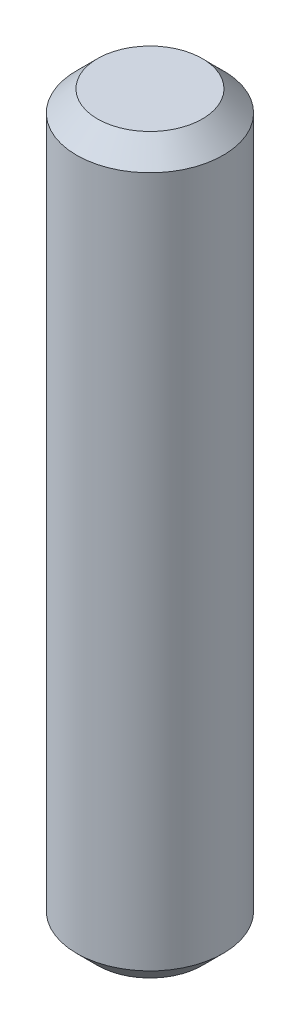
ISO-10303-21;
HEADER;
FILE_DESCRIPTION(('STEP AP214'),'2;1');
FILE_NAME('part.step','',(''),(''),'','','');
FILE_SCHEMA(('AUTOMOTIVE_DESIGN { 1 0 10303 214 1 1 1 1 }'));
ENDSEC;
DATA;
#1=APPLICATION_CONTEXT('core data for automotive mechanical design processes');
#2=APPLICATION_PROTOCOL_DEFINITION('international standard','automotive_design',2000,#1);
#3=PRODUCT_CONTEXT('',#1,'mechanical');
#4=PRODUCT('Part','Part','',(#3));
#5=PRODUCT_RELATED_PRODUCT_CATEGORY('part','',(#4));
#6=PRODUCT_DEFINITION_FORMATION('','',#4);
#7=PRODUCT_DEFINITION_CONTEXT('part definition',#1,'design');
#8=PRODUCT_DEFINITION('design','',#6,#7);
#9=PRODUCT_DEFINITION_SHAPE('','',#8);
#10=(LENGTH_UNIT() NAMED_UNIT(*) SI_UNIT(.MILLI.,.METRE.));
#11=(NAMED_UNIT(*) PLANE_ANGLE_UNIT() SI_UNIT($,.RADIAN.));
#12=(NAMED_UNIT(*) SI_UNIT($,.STERADIAN.) SOLID_ANGLE_UNIT());
#13=UNCERTAINTY_MEASURE_WITH_UNIT(LENGTH_MEASURE(1.E-05),#10,'distance_accuracy_value','');
#14=(GEOMETRIC_REPRESENTATION_CONTEXT(3) GLOBAL_UNCERTAINTY_ASSIGNED_CONTEXT((#13)) GLOBAL_UNIT_ASSIGNED_CONTEXT((#10,
#11,#12)) REPRESENTATION_CONTEXT('',''));
#15=CARTESIAN_POINT('',(0.,0.,0.));
#16=DIRECTION('',(0.,0.,1.));
#17=DIRECTION('',(1.,0.,0.));
#18=AXIS2_PLACEMENT_3D('',#15,#16,#17);
#19=CARTESIAN_POINT('',(0.,70.,0.));
#20=DIRECTION('',(0.,-1.,0.));
#21=DIRECTION('',(0.,0.,-1.));
#22=AXIS2_PLACEMENT_3D('',#19,#20,#21);
#23=CYLINDRICAL_SURFACE('',#22,7.);
#24=CARTESIAN_POINT('',(0.,2.00000000000002,0.));
#25=DIRECTION('',(0.,1.,0.));
#26=DIRECTION('',(0.,0.,1.));
#27=AXIS2_PLACEMENT_3D('',#24,#25,#26);
#28=CIRCLE('',#27,7.);
#29=CARTESIAN_POINT('',(0.,2.00000000000002,7.));
#30=VERTEX_POINT('',#29);
#31=EDGE_CURVE('E59',#30,#30,#28,.T.);
#32=ORIENTED_EDGE('',*,*,#31,.T.);
#33=EDGE_LOOP('',(#32));
#34=FACE_BOUND('',#33,.T.);
#35=CARTESIAN_POINT('',(0.,68.,0.));
#36=DIRECTION('',(0.,1.,0.));
#37=DIRECTION('',(0.,0.,1.));
#38=AXIS2_PLACEMENT_3D('',#35,#36,#37);
#39=CIRCLE('',#38,7.);
#40=CARTESIAN_POINT('',(0.,68.,7.));
#41=VERTEX_POINT('',#40);
#42=EDGE_CURVE('E64',#41,#41,#39,.F.);
#43=ORIENTED_EDGE('',*,*,#42,.T.);
#44=EDGE_LOOP('',(#43));
#45=FACE_BOUND('',#44,.T.);
#46=ADVANCED_FACE('F45',(#34,#45),#23,.T.);
#47=CARTESIAN_POINT('',(0.,70.,0.));
#48=DIRECTION('',(0.,1.,0.));
#49=DIRECTION('',(0.,0.,1.));
#50=AXIS2_PLACEMENT_3D('',#47,#48,#49);
#51=PLANE('',#50);
#52=CARTESIAN_POINT('',(0.,70.,0.));
#53=DIRECTION('',(0.,1.,0.));
#54=DIRECTION('',(0.,0.,1.));
#55=AXIS2_PLACEMENT_3D('',#52,#53,#54);
#56=CIRCLE('',#55,4.99999999999998);
#57=CARTESIAN_POINT('',(0.,70.,4.99999999999998));
#58=VERTEX_POINT('',#57);
#59=EDGE_CURVE('E10',#58,#58,#56,.T.);
#60=ORIENTED_EDGE('',*,*,#59,.T.);
#61=EDGE_LOOP('',(#60));
#62=FACE_BOUND('',#61,.T.);
#63=ADVANCED_FACE('F81',(#62),#51,.T.);
#64=CARTESIAN_POINT('',(0.,0.,0.));
#65=DIRECTION('',(0.,1.,0.));
#66=DIRECTION('',(0.,0.,1.));
#67=AXIS2_PLACEMENT_3D('',#64,#65,#66);
#68=PLANE('',#67);
#69=CARTESIAN_POINT('',(0.,0.,0.));
#70=DIRECTION('',(0.,1.,0.));
#71=DIRECTION('',(0.,0.,1.));
#72=AXIS2_PLACEMENT_3D('',#69,#70,#71);
#73=CIRCLE('',#72,4.99999999999998);
#74=CARTESIAN_POINT('',(0.,0.,4.99999999999998));
#75=VERTEX_POINT('',#74);
#76=EDGE_CURVE('E54',#75,#75,#73,.F.);
#77=ORIENTED_EDGE('',*,*,#76,.T.);
#78=EDGE_LOOP('',(#77));
#79=FACE_BOUND('',#78,.T.);
#80=ADVANCED_FACE('F78',(#79),#68,.F.);
#81=CARTESIAN_POINT('',(0.,2.00000000000002,0.));
#82=DIRECTION('',(0.,1.,0.));
#83=DIRECTION('',(0.,0.,1.));
#84=AXIS2_PLACEMENT_3D('',#81,#82,#83);
#85=CONICAL_SURFACE('',#84,7.,0.78539816339745);
#86=ORIENTED_EDGE('',*,*,#76,.F.);
#87=EDGE_LOOP('',(#86));
#88=FACE_BOUND('',#87,.T.);
#89=ORIENTED_EDGE('',*,*,#31,.F.);
#90=EDGE_LOOP('',(#89));
#91=FACE_BOUND('',#90,.T.);
#92=ADVANCED_FACE('F74',(#88,#91),#85,.T.);
#93=CARTESIAN_POINT('',(0.,70.,0.));
#94=DIRECTION('',(0.,-1.,0.));
#95=DIRECTION('',(0.,0.,-1.));
#96=AXIS2_PLACEMENT_3D('',#93,#94,#95);
#97=CONICAL_SURFACE('',#96,4.99999999999998,0.785398163397449);
#98=ORIENTED_EDGE('',*,*,#42,.F.);
#99=EDGE_LOOP('',(#98));
#100=FACE_BOUND('',#99,.T.);
#101=ORIENTED_EDGE('',*,*,#59,.F.);
#102=EDGE_LOOP('',(#101));
#103=FACE_BOUND('',#102,.T.);
#104=ADVANCED_FACE('F48',(#100,#103),#97,.T.);
#105=CLOSED_SHELL('',(#46,#63,#80,#92,#104));
#106=MANIFOLD_SOLID_BREP('B2',#105);
#107=ADVANCED_BREP_SHAPE_REPRESENTATION('',(#18,#106),#14);
#108=SHAPE_DEFINITION_REPRESENTATION(#9,#107);
ENDSEC;
END-ISO-10303-21;
